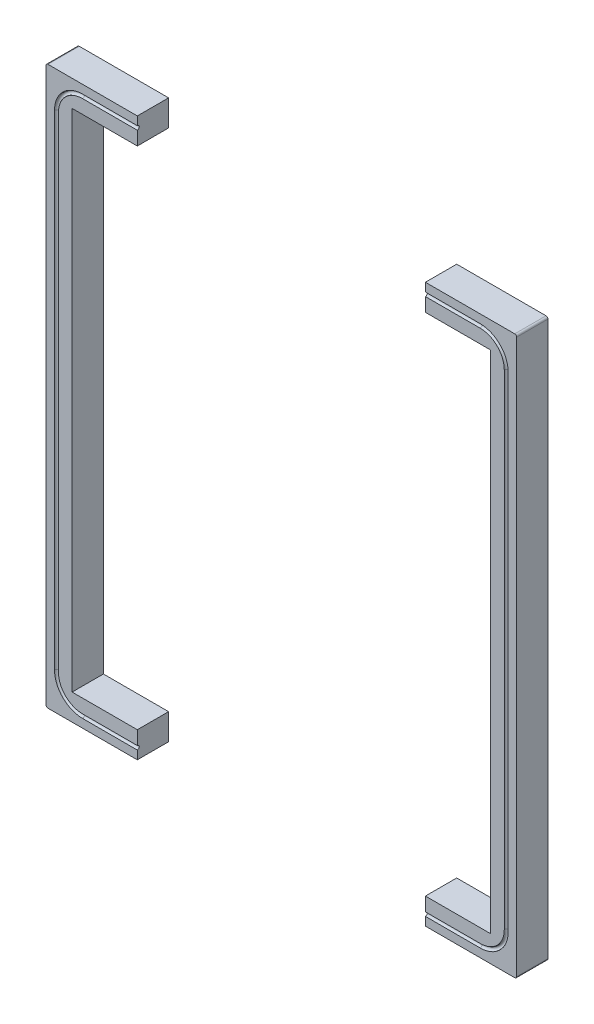
ISO-10303-21;
HEADER;
FILE_DESCRIPTION(('STEP AP214'),'2;1');
FILE_NAME('part.step','',(''),(''),'','','');
FILE_SCHEMA(('AUTOMOTIVE_DESIGN { 1 0 10303 214 1 1 1 1 }'));
ENDSEC;
DATA;
#1=APPLICATION_CONTEXT('core data for automotive mechanical design processes');
#2=APPLICATION_PROTOCOL_DEFINITION('international standard','automotive_design',2000,#1);
#3=PRODUCT_CONTEXT('',#1,'mechanical');
#4=PRODUCT('Part','Part','',(#3));
#5=PRODUCT_RELATED_PRODUCT_CATEGORY('part','',(#4));
#6=PRODUCT_DEFINITION_FORMATION('','',#4);
#7=PRODUCT_DEFINITION_CONTEXT('part definition',#1,'design');
#8=PRODUCT_DEFINITION('design','',#6,#7);
#9=PRODUCT_DEFINITION_SHAPE('','',#8);
#10=(LENGTH_UNIT() NAMED_UNIT(*) SI_UNIT(.MILLI.,.METRE.));
#11=(NAMED_UNIT(*) PLANE_ANGLE_UNIT() SI_UNIT($,.RADIAN.));
#12=(NAMED_UNIT(*) SI_UNIT($,.STERADIAN.) SOLID_ANGLE_UNIT());
#13=UNCERTAINTY_MEASURE_WITH_UNIT(LENGTH_MEASURE(1.E-05),#10,'distance_accuracy_value','');
#14=(GEOMETRIC_REPRESENTATION_CONTEXT(3) GLOBAL_UNCERTAINTY_ASSIGNED_CONTEXT((#13)) GLOBAL_UNIT_ASSIGNED_CONTEXT((#10,
#11,#12)) REPRESENTATION_CONTEXT('',''));
#15=CARTESIAN_POINT('',(0.,0.,0.));
#16=DIRECTION('',(0.,0.,1.));
#17=DIRECTION('',(1.,0.,0.));
#18=AXIS2_PLACEMENT_3D('',#15,#16,#17);
#19=CARTESIAN_POINT('',(-76.1520295904938,8.24310096287703,12.));
#20=DIRECTION('',(0.,0.,1.));
#21=DIRECTION('',(1.,0.,0.));
#22=AXIS2_PLACEMENT_3D('',#19,#20,#21);
#23=PLANE('',#22);
#24=DIRECTION('',(0.,-1.,0.));
#25=VECTOR('',#24,1.);
#26=CARTESIAN_POINT('',(69.3179704095062,222.084100962877,12.));
#27=LINE('',#26,#25);
#28=CARTESIAN_POINT('',(69.3179704095062,11.493100962877,12.));
#29=VERTEX_POINT('',#28);
#30=CARTESIAN_POINT('',(69.3179704095062,8.24310096287703,12.));
#31=VERTEX_POINT('',#30);
#32=EDGE_CURVE('E74',#29,#31,#27,.T.);
#33=ORIENTED_EDGE('',*,*,#32,.T.);
#34=DIRECTION('',(1.,0.,0.));
#35=VECTOR('',#34,1.);
#36=CARTESIAN_POINT('',(-76.1520295904938,8.24310096287703,12.));
#37=LINE('',#36,#35);
#38=CARTESIAN_POINT('',(103.581370409506,8.24310096287703,12.));
#39=VERTEX_POINT('',#38);
#40=EDGE_CURVE('E87',#31,#39,#37,.T.);
#41=ORIENTED_EDGE('',*,*,#40,.T.);
#42=CARTESIAN_POINT('',(103.581370409506,8.97970096287704,12.));
#43=DIRECTION('',(0.,0.,1.));
#44=DIRECTION('',(1.,0.,0.));
#45=AXIS2_PLACEMENT_3D('',#42,#43,#44);
#46=CIRCLE('',#45,0.7366);
#47=CARTESIAN_POINT('',(104.317970409506,8.97970096287709,12.));
#48=VERTEX_POINT('',#47);
#49=EDGE_CURVE('E96',#39,#48,#46,.T.);
#50=ORIENTED_EDGE('',*,*,#49,.T.);
#51=DIRECTION('',(0.,1.,0.));
#52=VECTOR('',#51,1.);
#53=CARTESIAN_POINT('',(104.317970409506,222.083100962877,12.));
#54=LINE('',#53,#52);
#55=CARTESIAN_POINT('',(104.317970409506,221.346500962877,12.));
#56=VERTEX_POINT('',#55);
#57=EDGE_CURVE('E98',#48,#56,#54,.T.);
#58=ORIENTED_EDGE('',*,*,#57,.T.);
#59=CARTESIAN_POINT('',(103.581370409506,221.346500962877,12.));
#60=DIRECTION('',(0.,0.,1.));
#61=DIRECTION('',(1.,0.,0.));
#62=AXIS2_PLACEMENT_3D('',#59,#60,#61);
#63=CIRCLE('',#62,0.7366);
#64=CARTESIAN_POINT('',(103.581370409506,222.083100962877,12.));
#65=VERTEX_POINT('',#64);
#66=EDGE_CURVE('E221',#56,#65,#63,.T.);
#67=ORIENTED_EDGE('',*,*,#66,.T.);
#68=DIRECTION('',(-1.,0.,0.));
#69=VECTOR('',#68,1.);
#70=CARTESIAN_POINT('',(-76.1520295904938,222.083100962877,12.));
#71=LINE('',#70,#69);
#72=CARTESIAN_POINT('',(69.3179704095062,222.083100962877,12.));
#73=VERTEX_POINT('',#72);
#74=EDGE_CURVE('E102',#65,#73,#71,.T.);
#75=ORIENTED_EDGE('',*,*,#74,.T.);
#76=DIRECTION('',(0.,1.,0.));
#77=VECTOR('',#76,1.);
#78=CARTESIAN_POINT('',(69.3179704095062,8.24210096287703,12.));
#79=LINE('',#78,#77);
#80=CARTESIAN_POINT('',(69.3179704095062,218.833100962877,12.));
#81=VERTEX_POINT('',#80);
#82=EDGE_CURVE('E152',#81,#73,#79,.T.);
#83=ORIENTED_EDGE('',*,*,#82,.F.);
#84=DIRECTION('',(-1.,0.,0.));
#85=VECTOR('',#84,1.);
#86=CARTESIAN_POINT('',(90.3179704095061,218.833100962877,12.));
#87=LINE('',#86,#85);
#88=CARTESIAN_POINT('',(90.3179704095061,218.833100962877,12.));
#89=VERTEX_POINT('',#88);
#90=EDGE_CURVE('E110',#81,#89,#87,.F.);
#91=ORIENTED_EDGE('',*,*,#90,.T.);
#92=CARTESIAN_POINT('',(90.3179704095062,208.083100962877,12.));
#93=DIRECTION('',(0.,0.,1.));
#94=DIRECTION('',(1.,0.,0.));
#95=AXIS2_PLACEMENT_3D('',#92,#93,#94);
#96=CIRCLE('',#95,10.75);
#97=CARTESIAN_POINT('',(101.067970409506,208.083100962877,12.));
#98=VERTEX_POINT('',#97);
#99=EDGE_CURVE('E208',#98,#89,#96,.T.);
#100=ORIENTED_EDGE('',*,*,#99,.F.);
#101=DIRECTION('',(0.,-1.,0.));
#102=VECTOR('',#101,1.);
#103=CARTESIAN_POINT('',(101.067970409506,208.083100962877,12.));
#104=LINE('',#103,#102);
#105=CARTESIAN_POINT('',(101.067970409506,22.2431009628771,12.));
#106=VERTEX_POINT('',#105);
#107=EDGE_CURVE('E197',#106,#98,#104,.F.);
#108=ORIENTED_EDGE('',*,*,#107,.F.);
#109=CARTESIAN_POINT('',(90.3179704095062,22.243100962877,12.));
#110=DIRECTION('',(0.,0.,1.));
#111=DIRECTION('',(1.,0.,0.));
#112=AXIS2_PLACEMENT_3D('',#109,#110,#111);
#113=CIRCLE('',#112,10.75);
#114=CARTESIAN_POINT('',(90.3179704095061,11.493100962877,12.));
#115=VERTEX_POINT('',#114);
#116=EDGE_CURVE('E184',#115,#106,#113,.T.);
#117=ORIENTED_EDGE('',*,*,#116,.F.);
#118=DIRECTION('',(-1.,0.,0.));
#119=VECTOR('',#118,1.);
#120=CARTESIAN_POINT('',(90.3179704095061,11.493100962877,12.));
#121=LINE('',#120,#119);
#122=EDGE_CURVE('E91',#29,#115,#121,.F.);
#123=ORIENTED_EDGE('',*,*,#122,.F.);
#124=EDGE_LOOP('',(#33,#41,#50,#58,#67,#75,#83,#91,#100,#108,#117,#123));
#125=FACE_BOUND('',#124,.T.);
#126=ADVANCED_FACE('F40',(#125),#23,.T.);
#127=CARTESIAN_POINT('',(-76.1520295904938,8.24310096287703,12.));
#128=DIRECTION('',(0.,1.,0.));
#129=DIRECTION('',(0.,0.,1.));
#130=AXIS2_PLACEMENT_3D('',#127,#128,#129);
#131=PLANE('',#130);
#132=ORIENTED_EDGE('',*,*,#40,.F.);
#133=DIRECTION('',(0.,0.,1.));
#134=VECTOR('',#133,1.);
#135=CARTESIAN_POINT('',(69.3179704095062,8.24310096287703,12.));
#136=LINE('',#135,#134);
#137=CARTESIAN_POINT('',(69.3179704095062,8.24310096287703,0.));
#138=VERTEX_POINT('',#137);
#139=EDGE_CURVE('E49',#138,#31,#136,.T.);
#140=ORIENTED_EDGE('',*,*,#139,.F.);
#141=DIRECTION('',(1.,0.,0.));
#142=VECTOR('',#141,1.);
#143=CARTESIAN_POINT('',(-76.1520295904938,8.24310096287703,0.));
#144=LINE('',#143,#142);
#145=CARTESIAN_POINT('',(103.581370409506,8.24310096287703,0.));
#146=VERTEX_POINT('',#145);
#147=EDGE_CURVE('E108',#138,#146,#144,.T.);
#148=ORIENTED_EDGE('',*,*,#147,.T.);
#149=DIRECTION('',(0.,0.,-1.));
#150=VECTOR('',#149,1.);
#151=CARTESIAN_POINT('',(103.581370409506,8.24310096287703,12.));
#152=LINE('',#151,#150);
#153=EDGE_CURVE('E94',#146,#39,#152,.F.);
#154=ORIENTED_EDGE('',*,*,#153,.T.);
#155=EDGE_LOOP('',(#132,#140,#148,#154));
#156=FACE_BOUND('',#155,.T.);
#157=ADVANCED_FACE('F42',(#156),#131,.F.);
#158=CARTESIAN_POINT('',(69.3179704095062,18.243100962877,12.));
#159=VERTEX_POINT('',#158);
#160=CARTESIAN_POINT('',(69.3179704095062,12.993100962877,12.));
#161=VERTEX_POINT('',#160);
#162=EDGE_CURVE('E56',#159,#161,#27,.T.);
#163=ORIENTED_EDGE('',*,*,#162,.T.);
#164=DIRECTION('',(-1.,0.,0.));
#165=VECTOR('',#164,1.);
#166=CARTESIAN_POINT('',(90.3179704095061,12.993100962877,12.));
#167=LINE('',#166,#165);
#168=CARTESIAN_POINT('',(90.3179704095061,12.993100962877,12.));
#169=VERTEX_POINT('',#168);
#170=EDGE_CURVE('E119',#169,#161,#167,.T.);
#171=ORIENTED_EDGE('',*,*,#170,.F.);
#172=CARTESIAN_POINT('',(90.3179704095062,22.243100962877,12.));
#173=DIRECTION('',(0.,0.,-1.));
#174=DIRECTION('',(-1.,0.,0.));
#175=AXIS2_PLACEMENT_3D('',#172,#173,#174);
#176=CIRCLE('',#175,9.25000000000001);
#177=CARTESIAN_POINT('',(99.5679704095062,22.2431009628771,12.));
#178=VERTEX_POINT('',#177);
#179=EDGE_CURVE('E193',#178,#169,#176,.T.);
#180=ORIENTED_EDGE('',*,*,#179,.F.);
#181=DIRECTION('',(0.,-1.,0.));
#182=VECTOR('',#181,1.);
#183=CARTESIAN_POINT('',(99.5679704095062,208.083100962877,12.));
#184=LINE('',#183,#182);
#185=CARTESIAN_POINT('',(99.5679704095062,208.083100962877,12.));
#186=VERTEX_POINT('',#185);
#187=EDGE_CURVE('E192',#186,#178,#184,.T.);
#188=ORIENTED_EDGE('',*,*,#187,.F.);
#189=CARTESIAN_POINT('',(90.3179704095062,208.083100962877,12.));
#190=DIRECTION('',(0.,0.,-1.));
#191=DIRECTION('',(-1.,0.,0.));
#192=AXIS2_PLACEMENT_3D('',#189,#190,#191);
#193=CIRCLE('',#192,9.25000000000001);
#194=CARTESIAN_POINT('',(90.3179704095061,217.333100962877,12.));
#195=VERTEX_POINT('',#194);
#196=EDGE_CURVE('E200',#195,#186,#193,.T.);
#197=ORIENTED_EDGE('',*,*,#196,.F.);
#198=DIRECTION('',(-1.,0.,0.));
#199=VECTOR('',#198,1.);
#200=CARTESIAN_POINT('',(90.3179704095061,217.333100962877,12.));
#201=LINE('',#200,#199);
#202=CARTESIAN_POINT('',(69.3179704095062,217.333100962877,12.));
#203=VERTEX_POINT('',#202);
#204=EDGE_CURVE('E132',#195,#203,#201,.T.);
#205=ORIENTED_EDGE('',*,*,#204,.T.);
#206=CARTESIAN_POINT('',(69.3179704095062,212.083100962877,12.));
#207=VERTEX_POINT('',#206);
#208=EDGE_CURVE('E159',#207,#203,#79,.T.);
#209=ORIENTED_EDGE('',*,*,#208,.F.);
#210=DIRECTION('',(-1.,0.,0.));
#211=VECTOR('',#210,1.);
#212=CARTESIAN_POINT('',(-66.1520295904938,212.083100962877,12.));
#213=LINE('',#212,#211);
#214=CARTESIAN_POINT('',(94.3179704095062,212.083100962877,12.));
#215=VERTEX_POINT('',#214);
#216=EDGE_CURVE('E116',#215,#207,#213,.T.);
#217=ORIENTED_EDGE('',*,*,#216,.F.);
#218=DIRECTION('',(0.,1.,0.));
#219=VECTOR('',#218,1.);
#220=CARTESIAN_POINT('',(94.3179704095062,212.083100962877,12.));
#221=LINE('',#220,#219);
#222=CARTESIAN_POINT('',(94.3179704095062,18.243100962877,12.));
#223=VERTEX_POINT('',#222);
#224=EDGE_CURVE('E182',#223,#215,#221,.T.);
#225=ORIENTED_EDGE('',*,*,#224,.F.);
#226=DIRECTION('',(1.,0.,0.));
#227=VECTOR('',#226,1.);
#228=CARTESIAN_POINT('',(-66.1520295904938,18.243100962877,12.));
#229=LINE('',#228,#227);
#230=EDGE_CURVE('E114',#159,#223,#229,.T.);
#231=ORIENTED_EDGE('',*,*,#230,.F.);
#232=EDGE_LOOP('',(#163,#171,#180,#188,#197,#205,#209,#217,#225,#231));
#233=FACE_BOUND('',#232,.T.);
#234=ADVANCED_FACE('F274',(#233),#23,.T.);
#235=CARTESIAN_POINT('',(-76.1520295904938,8.24310096287703,0.));
#236=DIRECTION('',(0.,0.,1.));
#237=DIRECTION('',(1.,0.,0.));
#238=AXIS2_PLACEMENT_3D('',#235,#236,#237);
#239=PLANE('',#238);
#240=ORIENTED_EDGE('',*,*,#147,.F.);
#241=DIRECTION('',(0.,-1.,0.));
#242=VECTOR('',#241,1.);
#243=CARTESIAN_POINT('',(69.3179704095062,222.084100962877,0.));
#244=LINE('',#243,#242);
#245=CARTESIAN_POINT('',(69.3179704095062,18.243100962877,0.));
#246=VERTEX_POINT('',#245);
#247=EDGE_CURVE('E76',#246,#138,#244,.T.);
#248=ORIENTED_EDGE('',*,*,#247,.F.);
#249=DIRECTION('',(-1.,0.,0.));
#250=VECTOR('',#249,1.);
#251=CARTESIAN_POINT('',(-66.1520295904938,18.243100962877,0.));
#252=LINE('',#251,#250);
#253=CARTESIAN_POINT('',(94.3179704095062,18.243100962877,0.));
#254=VERTEX_POINT('',#253);
#255=EDGE_CURVE('E111',#254,#246,#252,.T.);
#256=ORIENTED_EDGE('',*,*,#255,.F.);
#257=DIRECTION('',(0.,-1.,0.));
#258=VECTOR('',#257,1.);
#259=CARTESIAN_POINT('',(94.3179704095062,212.083100962877,0.));
#260=LINE('',#259,#258);
#261=CARTESIAN_POINT('',(94.3179704095062,212.083100962877,0.));
#262=VERTEX_POINT('',#261);
#263=EDGE_CURVE('E185',#262,#254,#260,.T.);
#264=ORIENTED_EDGE('',*,*,#263,.F.);
#265=DIRECTION('',(1.,0.,0.));
#266=VECTOR('',#265,1.);
#267=CARTESIAN_POINT('',(-66.1520295904938,212.083100962877,0.));
#268=LINE('',#267,#266);
#269=CARTESIAN_POINT('',(69.3179704095062,212.083100962877,0.));
#270=VERTEX_POINT('',#269);
#271=EDGE_CURVE('E44',#270,#262,#268,.T.);
#272=ORIENTED_EDGE('',*,*,#271,.F.);
#273=DIRECTION('',(0.,1.,0.));
#274=VECTOR('',#273,1.);
#275=CARTESIAN_POINT('',(69.3179704095062,8.24210096287703,0.));
#276=LINE('',#275,#274);
#277=CARTESIAN_POINT('',(69.3179704095062,222.083100962877,0.));
#278=VERTEX_POINT('',#277);
#279=EDGE_CURVE('E134',#270,#278,#276,.T.);
#280=ORIENTED_EDGE('',*,*,#279,.T.);
#281=DIRECTION('',(-1.,0.,0.));
#282=VECTOR('',#281,1.);
#283=CARTESIAN_POINT('',(-76.1520295904938,222.083100962877,0.));
#284=LINE('',#283,#282);
#285=CARTESIAN_POINT('',(103.581370409506,222.083100962877,0.));
#286=VERTEX_POINT('',#285);
#287=EDGE_CURVE('E104',#286,#278,#284,.T.);
#288=ORIENTED_EDGE('',*,*,#287,.F.);
#289=CARTESIAN_POINT('',(103.581370409506,221.346500962877,0.));
#290=DIRECTION('',(0.,0.,1.));
#291=DIRECTION('',(1.,0.,0.));
#292=AXIS2_PLACEMENT_3D('',#289,#290,#291);
#293=CIRCLE('',#292,0.7366);
#294=CARTESIAN_POINT('',(104.317970409506,221.346500962877,0.));
#295=VERTEX_POINT('',#294);
#296=EDGE_CURVE('E141',#286,#295,#293,.F.);
#297=ORIENTED_EDGE('',*,*,#296,.T.);
#298=DIRECTION('',(0.,1.,0.));
#299=VECTOR('',#298,1.);
#300=CARTESIAN_POINT('',(104.317970409506,222.083100962877,0.));
#301=LINE('',#300,#299);
#302=CARTESIAN_POINT('',(104.317970409506,8.97970096287709,0.));
#303=VERTEX_POINT('',#302);
#304=EDGE_CURVE('E220',#303,#295,#301,.T.);
#305=ORIENTED_EDGE('',*,*,#304,.F.);
#306=CARTESIAN_POINT('',(103.581370409506,8.97970096287704,0.));
#307=DIRECTION('',(0.,0.,1.));
#308=DIRECTION('',(1.,0.,0.));
#309=AXIS2_PLACEMENT_3D('',#306,#307,#308);
#310=CIRCLE('',#309,0.7366);
#311=EDGE_CURVE('E115',#303,#146,#310,.F.);
#312=ORIENTED_EDGE('',*,*,#311,.T.);
#313=EDGE_LOOP('',(#240,#248,#256,#264,#272,#280,#288,#297,#305,#312));
#314=FACE_BOUND('',#313,.T.);
#315=ADVANCED_FACE('F259',(#314),#239,.F.);
#316=CARTESIAN_POINT('',(-66.1520295904938,18.243100962877,-0.000999999999999265));
#317=DIRECTION('',(0.,-1.,0.));
#318=DIRECTION('',(0.,0.,-1.));
#319=AXIS2_PLACEMENT_3D('',#316,#317,#318);
#320=PLANE('',#319);
#321=ORIENTED_EDGE('',*,*,#255,.T.);
#322=DIRECTION('',(0.,0.,-1.));
#323=VECTOR('',#322,1.);
#324=CARTESIAN_POINT('',(69.3179704095062,18.243100962877,12.));
#325=LINE('',#324,#323);
#326=EDGE_CURVE('E148',#159,#246,#325,.T.);
#327=ORIENTED_EDGE('',*,*,#326,.F.);
#328=ORIENTED_EDGE('',*,*,#230,.T.);
#329=DIRECTION('',(0.,0.,1.));
#330=VECTOR('',#329,1.);
#331=CARTESIAN_POINT('',(94.3179704095062,18.243100962877,-0.000999999999999265));
#332=LINE('',#331,#330);
#333=EDGE_CURVE('E180',#254,#223,#332,.T.);
#334=ORIENTED_EDGE('',*,*,#333,.F.);
#335=EDGE_LOOP('',(#321,#327,#328,#334));
#336=FACE_BOUND('',#335,.T.);
#337=ADVANCED_FACE('F313',(#336),#320,.F.);
#338=CARTESIAN_POINT('',(90.3179704095061,12.243100962877,12.));
#339=DIRECTION('',(-1.,0.,0.));
#340=DIRECTION('',(0.,-1.,0.));
#341=AXIS2_PLACEMENT_3D('',#338,#339,#340);
#342=CYLINDRICAL_SURFACE('',#341,0.75);
#343=ORIENTED_EDGE('',*,*,#170,.T.);
#344=CARTESIAN_POINT('',(69.3179704095062,12.243100962877,12.));
#345=DIRECTION('',(1.,0.,0.));
#346=DIRECTION('',(0.,0.,-1.));
#347=AXIS2_PLACEMENT_3D('',#344,#345,#346);
#348=CIRCLE('',#347,0.75);
#349=EDGE_CURVE('E12',#29,#161,#348,.T.);
#350=ORIENTED_EDGE('',*,*,#349,.F.);
#351=ORIENTED_EDGE('',*,*,#122,.T.);
#352=CARTESIAN_POINT('',(90.3179704095061,12.243100962877,12.));
#353=DIRECTION('',(-1.,0.,0.));
#354=DIRECTION('',(0.,0.,-1.));
#355=AXIS2_PLACEMENT_3D('',#352,#353,#354);
#356=CIRCLE('',#355,0.75);
#357=EDGE_CURVE('E189',#169,#115,#356,.T.);
#358=ORIENTED_EDGE('',*,*,#357,.F.);
#359=EDGE_LOOP('',(#343,#350,#351,#358));
#360=FACE_BOUND('',#359,.T.);
#361=ADVANCED_FACE('F340',(#360),#342,.F.);
#362=CARTESIAN_POINT('',(-76.1520295904938,222.083100962877,12.));
#363=DIRECTION('',(0.,-1.,0.));
#364=DIRECTION('',(0.,0.,-1.));
#365=AXIS2_PLACEMENT_3D('',#362,#363,#364);
#366=PLANE('',#365);
#367=ORIENTED_EDGE('',*,*,#287,.T.);
#368=DIRECTION('',(0.,0.,-1.));
#369=VECTOR('',#368,1.);
#370=CARTESIAN_POINT('',(69.3179704095062,222.083100962877,0.));
#371=LINE('',#370,#369);
#372=EDGE_CURVE('E150',#73,#278,#371,.T.);
#373=ORIENTED_EDGE('',*,*,#372,.F.);
#374=ORIENTED_EDGE('',*,*,#74,.F.);
#375=DIRECTION('',(0.,0.,-1.));
#376=VECTOR('',#375,1.);
#377=CARTESIAN_POINT('',(103.581370409506,222.083100962877,12.));
#378=LINE('',#377,#376);
#379=EDGE_CURVE('E107',#65,#286,#378,.T.);
#380=ORIENTED_EDGE('',*,*,#379,.T.);
#381=EDGE_LOOP('',(#367,#373,#374,#380));
#382=FACE_BOUND('',#381,.T.);
#383=ADVANCED_FACE('F255',(#382),#366,.F.);
#384=CARTESIAN_POINT('',(-66.1520295904938,212.083100962877,-0.000999999999999265));
#385=DIRECTION('',(0.,1.,0.));
#386=DIRECTION('',(0.,0.,1.));
#387=AXIS2_PLACEMENT_3D('',#384,#385,#386);
#388=PLANE('',#387);
#389=ORIENTED_EDGE('',*,*,#216,.T.);
#390=DIRECTION('',(0.,0.,1.));
#391=VECTOR('',#390,1.);
#392=CARTESIAN_POINT('',(69.3179704095062,212.083100962877,0.));
#393=LINE('',#392,#391);
#394=EDGE_CURVE('E146',#270,#207,#393,.T.);
#395=ORIENTED_EDGE('',*,*,#394,.F.);
#396=ORIENTED_EDGE('',*,*,#271,.T.);
#397=DIRECTION('',(0.,0.,1.));
#398=VECTOR('',#397,1.);
#399=CARTESIAN_POINT('',(94.3179704095062,212.083100962877,-0.000999999999999265));
#400=LINE('',#399,#398);
#401=EDGE_CURVE('E164',#262,#215,#400,.T.);
#402=ORIENTED_EDGE('',*,*,#401,.T.);
#403=EDGE_LOOP('',(#389,#395,#396,#402));
#404=FACE_BOUND('',#403,.T.);
#405=ADVANCED_FACE('F269',(#404),#388,.F.);
#406=CARTESIAN_POINT('',(90.3179704095061,218.083100962877,12.));
#407=DIRECTION('',(-1.,0.,0.));
#408=DIRECTION('',(0.,0.,1.));
#409=AXIS2_PLACEMENT_3D('',#406,#407,#408);
#410=CYLINDRICAL_SURFACE('',#409,0.75);
#411=CARTESIAN_POINT('',(69.3179704095062,218.083100962877,12.));
#412=DIRECTION('',(1.,0.,0.));
#413=DIRECTION('',(0.,0.,-1.));
#414=AXIS2_PLACEMENT_3D('',#411,#412,#413);
#415=CIRCLE('',#414,0.75);
#416=EDGE_CURVE('E161',#81,#203,#415,.F.);
#417=ORIENTED_EDGE('',*,*,#416,.T.);
#418=ORIENTED_EDGE('',*,*,#204,.F.);
#419=CARTESIAN_POINT('',(90.3179704095061,218.083100962877,12.));
#420=DIRECTION('',(1.,0.,0.));
#421=DIRECTION('',(0.,0.,-1.));
#422=AXIS2_PLACEMENT_3D('',#419,#420,#421);
#423=CIRCLE('',#422,0.75);
#424=EDGE_CURVE('E163',#195,#89,#423,.T.);
#425=ORIENTED_EDGE('',*,*,#424,.T.);
#426=ORIENTED_EDGE('',*,*,#90,.F.);
#427=EDGE_LOOP('',(#417,#418,#425,#426));
#428=FACE_BOUND('',#427,.T.);
#429=ADVANCED_FACE('F349',(#428),#410,.F.);
#430=CARTESIAN_POINT('',(104.317970409506,222.083100962877,12.));
#431=DIRECTION('',(-1.,0.,0.));
#432=DIRECTION('',(0.,-1.,0.));
#433=AXIS2_PLACEMENT_3D('',#430,#431,#432);
#434=PLANE('',#433);
#435=ORIENTED_EDGE('',*,*,#57,.F.);
#436=DIRECTION('',(0.,0.,-1.));
#437=VECTOR('',#436,1.);
#438=CARTESIAN_POINT('',(104.317970409506,8.97970096287704,12.));
#439=LINE('',#438,#437);
#440=EDGE_CURVE('E169',#48,#303,#439,.T.);
#441=ORIENTED_EDGE('',*,*,#440,.T.);
#442=ORIENTED_EDGE('',*,*,#304,.T.);
#443=DIRECTION('',(0.,0.,-1.));
#444=VECTOR('',#443,1.);
#445=CARTESIAN_POINT('',(104.317970409506,221.346500962877,12.));
#446=LINE('',#445,#444);
#447=EDGE_CURVE('E188',#295,#56,#446,.F.);
#448=ORIENTED_EDGE('',*,*,#447,.T.);
#449=EDGE_LOOP('',(#435,#441,#442,#448));
#450=FACE_BOUND('',#449,.T.);
#451=ADVANCED_FACE('F243',(#450),#434,.F.);
#452=CARTESIAN_POINT('',(103.581370409506,221.346500962877,12.));
#453=DIRECTION('',(0.,0.,-1.));
#454=DIRECTION('',(-1.,0.,0.));
#455=AXIS2_PLACEMENT_3D('',#452,#453,#454);
#456=CYLINDRICAL_SURFACE('',#455,0.7366);
#457=ORIENTED_EDGE('',*,*,#66,.F.);
#458=ORIENTED_EDGE('',*,*,#447,.F.);
#459=ORIENTED_EDGE('',*,*,#296,.F.);
#460=ORIENTED_EDGE('',*,*,#379,.F.);
#461=EDGE_LOOP('',(#457,#458,#459,#460));
#462=FACE_BOUND('',#461,.T.);
#463=ADVANCED_FACE('F249',(#462),#456,.T.);
#464=CARTESIAN_POINT('',(103.581370409506,8.97970096287704,12.));
#465=DIRECTION('',(0.,0.,-1.));
#466=DIRECTION('',(-1.,0.,0.));
#467=AXIS2_PLACEMENT_3D('',#464,#465,#466);
#468=CYLINDRICAL_SURFACE('',#467,0.7366);
#469=ORIENTED_EDGE('',*,*,#49,.F.);
#470=ORIENTED_EDGE('',*,*,#153,.F.);
#471=ORIENTED_EDGE('',*,*,#311,.F.);
#472=ORIENTED_EDGE('',*,*,#440,.F.);
#473=EDGE_LOOP('',(#469,#470,#471,#472));
#474=FACE_BOUND('',#473,.T.);
#475=ADVANCED_FACE('F311',(#474),#468,.T.);
#476=CARTESIAN_POINT('',(94.3179704095062,212.083100962877,-0.000999999999999265));
#477=DIRECTION('',(1.,0.,0.));
#478=DIRECTION('',(0.,1.,0.));
#479=AXIS2_PLACEMENT_3D('',#476,#477,#478);
#480=PLANE('',#479);
#481=ORIENTED_EDGE('',*,*,#263,.T.);
#482=ORIENTED_EDGE('',*,*,#333,.T.);
#483=ORIENTED_EDGE('',*,*,#224,.T.);
#484=ORIENTED_EDGE('',*,*,#401,.F.);
#485=EDGE_LOOP('',(#481,#482,#483,#484));
#486=FACE_BOUND('',#485,.T.);
#487=ADVANCED_FACE('F315',(#486),#480,.F.);
#488=CARTESIAN_POINT('',(90.3179704095062,22.243100962877,12.));
#489=DIRECTION('',(0.,0.,-1.));
#490=DIRECTION('',(-1.,0.,0.));
#491=AXIS2_PLACEMENT_3D('',#488,#489,#490);
#492=TOROIDAL_SURFACE('',#491,10.,0.75);
#493=ORIENTED_EDGE('',*,*,#116,.T.);
#494=CARTESIAN_POINT('',(100.317970409506,22.2431009628771,12.));
#495=DIRECTION('',(0.,-1.,0.));
#496=DIRECTION('',(0.,0.,-1.));
#497=AXIS2_PLACEMENT_3D('',#494,#495,#496);
#498=CIRCLE('',#497,0.75);
#499=EDGE_CURVE('E194',#178,#106,#498,.T.);
#500=ORIENTED_EDGE('',*,*,#499,.F.);
#501=ORIENTED_EDGE('',*,*,#179,.T.);
#502=ORIENTED_EDGE('',*,*,#357,.T.);
#503=EDGE_LOOP('',(#493,#500,#501,#502));
#504=FACE_BOUND('',#503,.T.);
#505=ADVANCED_FACE('F317',(#504),#492,.F.);
#506=CARTESIAN_POINT('',(100.317970409506,208.083100962877,12.));
#507=DIRECTION('',(0.,-1.,0.));
#508=DIRECTION('',(1.,0.,0.));
#509=AXIS2_PLACEMENT_3D('',#506,#507,#508);
#510=CYLINDRICAL_SURFACE('',#509,0.75);
#511=ORIENTED_EDGE('',*,*,#187,.T.);
#512=ORIENTED_EDGE('',*,*,#499,.T.);
#513=ORIENTED_EDGE('',*,*,#107,.T.);
#514=CARTESIAN_POINT('',(100.317970409506,208.083100962877,12.));
#515=DIRECTION('',(0.,-1.,0.));
#516=DIRECTION('',(0.,0.,-1.));
#517=AXIS2_PLACEMENT_3D('',#514,#515,#516);
#518=CIRCLE('',#517,0.75);
#519=EDGE_CURVE('E198',#186,#98,#518,.T.);
#520=ORIENTED_EDGE('',*,*,#519,.F.);
#521=EDGE_LOOP('',(#511,#512,#513,#520));
#522=FACE_BOUND('',#521,.T.);
#523=ADVANCED_FACE('F323',(#522),#510,.F.);
#524=CARTESIAN_POINT('',(90.3179704095062,208.083100962877,12.));
#525=DIRECTION('',(0.,0.,-1.));
#526=DIRECTION('',(-1.,0.,0.));
#527=AXIS2_PLACEMENT_3D('',#524,#525,#526);
#528=TOROIDAL_SURFACE('',#527,10.,0.75);
#529=ORIENTED_EDGE('',*,*,#99,.T.);
#530=ORIENTED_EDGE('',*,*,#424,.F.);
#531=ORIENTED_EDGE('',*,*,#196,.T.);
#532=ORIENTED_EDGE('',*,*,#519,.T.);
#533=EDGE_LOOP('',(#529,#530,#531,#532));
#534=FACE_BOUND('',#533,.T.);
#535=ADVANCED_FACE('F356',(#534),#528,.F.);
#536=CARTESIAN_POINT('',(69.3179704095062,8.24210096287703,0.));
#537=DIRECTION('',(1.,0.,0.));
#538=DIRECTION('',(0.,0.,-1.));
#539=AXIS2_PLACEMENT_3D('',#536,#537,#538);
#540=PLANE('',#539);
#541=ORIENTED_EDGE('',*,*,#394,.T.);
#542=ORIENTED_EDGE('',*,*,#208,.T.);
#543=ORIENTED_EDGE('',*,*,#416,.F.);
#544=ORIENTED_EDGE('',*,*,#82,.T.);
#545=ORIENTED_EDGE('',*,*,#372,.T.);
#546=ORIENTED_EDGE('',*,*,#279,.F.);
#547=EDGE_LOOP('',(#541,#542,#543,#544,#545,#546));
#548=FACE_BOUND('',#547,.T.);
#549=ADVANCED_FACE('F266',(#548),#540,.F.);
#550=CARTESIAN_POINT('',(69.3179704095062,222.084100962877,12.));
#551=DIRECTION('',(1.,0.,0.));
#552=DIRECTION('',(0.,0.,-1.));
#553=AXIS2_PLACEMENT_3D('',#550,#551,#552);
#554=PLANE('',#553);
#555=ORIENTED_EDGE('',*,*,#326,.T.);
#556=ORIENTED_EDGE('',*,*,#247,.T.);
#557=ORIENTED_EDGE('',*,*,#139,.T.);
#558=ORIENTED_EDGE('',*,*,#32,.F.);
#559=ORIENTED_EDGE('',*,*,#349,.T.);
#560=ORIENTED_EDGE('',*,*,#162,.F.);
#561=EDGE_LOOP('',(#555,#556,#557,#558,#559,#560));
#562=FACE_BOUND('',#561,.T.);
#563=ADVANCED_FACE('F73',(#562),#554,.F.);
#564=CLOSED_SHELL('',(#126,#157,#234,#315,#337,#361,#383,#405,#429,#451,#463,#475,#487,#505,
#523,#535,#549,#563));
#565=MANIFOLD_SOLID_BREP('B2',#564);
#566=CARTESIAN_POINT('',(-72.1520295904938,22.2431009628771,12.));
#567=DIRECTION('',(0.,1.,0.));
#568=DIRECTION('',(-1.,0.,0.));
#569=AXIS2_PLACEMENT_3D('',#566,#567,#568);
#570=CYLINDRICAL_SURFACE('',#569,0.75);
#571=DIRECTION('',(0.,1.,0.));
#572=VECTOR('',#571,1.);
#573=CARTESIAN_POINT('',(-71.4020295904938,22.2431009628771,12.));
#574=LINE('',#573,#572);
#575=CARTESIAN_POINT('',(-71.4020295904938,22.2431009628771,12.));
#576=VERTEX_POINT('',#575);
#577=CARTESIAN_POINT('',(-71.4020295904938,208.083100962877,12.));
#578=VERTEX_POINT('',#577);
#579=EDGE_CURVE('E650',#576,#578,#574,.T.);
#580=ORIENTED_EDGE('',*,*,#579,.T.);
#581=CARTESIAN_POINT('',(-72.1520295904938,208.083100962877,12.));
#582=DIRECTION('',(0.,1.,0.));
#583=DIRECTION('',(0.,0.,-1.));
#584=AXIS2_PLACEMENT_3D('',#581,#582,#583);
#585=CIRCLE('',#584,0.75);
#586=CARTESIAN_POINT('',(-72.9020295904938,208.083100962877,12.));
#587=VERTEX_POINT('',#586);
#588=EDGE_CURVE('E669',#578,#587,#585,.T.);
#589=ORIENTED_EDGE('',*,*,#588,.T.);
#590=DIRECTION('',(0.,1.,0.));
#591=VECTOR('',#590,1.);
#592=CARTESIAN_POINT('',(-72.9020295904938,22.2431009628771,12.));
#593=LINE('',#592,#591);
#594=CARTESIAN_POINT('',(-72.9020295904938,22.2431009628771,12.));
#595=VERTEX_POINT('',#594);
#596=EDGE_CURVE('E484',#587,#595,#593,.F.);
#597=ORIENTED_EDGE('',*,*,#596,.T.);
#598=CARTESIAN_POINT('',(-72.1520295904938,22.2431009628771,12.));
#599=DIRECTION('',(0.,1.,0.));
#600=DIRECTION('',(0.,0.,-1.));
#601=AXIS2_PLACEMENT_3D('',#598,#599,#600);
#602=CIRCLE('',#601,0.75);
#603=EDGE_CURVE('E666',#576,#595,#602,.T.);
#604=ORIENTED_EDGE('',*,*,#603,.F.);
#605=EDGE_LOOP('',(#580,#589,#597,#604));
#606=FACE_BOUND('',#605,.T.);
#607=ADVANCED_FACE('F476',(#606),#570,.F.);
#608=CARTESIAN_POINT('',(-62.1520295904938,208.083100962877,12.));
#609=DIRECTION('',(0.,0.,-1.));
#610=DIRECTION('',(-1.,0.,0.));
#611=AXIS2_PLACEMENT_3D('',#608,#609,#610);
#612=TOROIDAL_SURFACE('',#611,10.,0.75);
#613=CARTESIAN_POINT('',(-62.1520295904938,208.083100962877,12.));
#614=DIRECTION('',(0.,0.,1.));
#615=DIRECTION('',(1.,0.,0.));
#616=AXIS2_PLACEMENT_3D('',#613,#614,#615);
#617=CIRCLE('',#616,10.75);
#618=CARTESIAN_POINT('',(-62.1520295904937,218.833100962877,12.));
#619=VERTEX_POINT('',#618);
#620=EDGE_CURVE('E38',#619,#587,#617,.T.);
#621=ORIENTED_EDGE('',*,*,#620,.T.);
#622=ORIENTED_EDGE('',*,*,#588,.F.);
#623=CARTESIAN_POINT('',(-62.1520295904938,208.083100962877,12.));
#624=DIRECTION('',(0.,0.,-1.));
#625=DIRECTION('',(-1.,0.,0.));
#626=AXIS2_PLACEMENT_3D('',#623,#624,#625);
#627=CIRCLE('',#626,9.25000000000002);
#628=CARTESIAN_POINT('',(-62.1520295904937,217.333100962877,12.));
#629=VERTEX_POINT('',#628);
#630=EDGE_CURVE('E652',#578,#629,#627,.T.);
#631=ORIENTED_EDGE('',*,*,#630,.T.);
#632=CARTESIAN_POINT('',(-62.1520295904937,218.083100962877,12.));
#633=DIRECTION('',(1.,0.,0.));
#634=DIRECTION('',(0.,0.,-1.));
#635=AXIS2_PLACEMENT_3D('',#632,#633,#634);
#636=CIRCLE('',#635,0.75);
#637=EDGE_CURVE('E689',#629,#619,#636,.T.);
#638=ORIENTED_EDGE('',*,*,#637,.T.);
#639=EDGE_LOOP('',(#621,#622,#631,#638));
#640=FACE_BOUND('',#639,.T.);
#641=ADVANCED_FACE('F766',(#640),#612,.F.);
#642=CARTESIAN_POINT('',(90.3179704095061,218.083100962877,12.));
#643=DIRECTION('',(-1.,0.,0.));
#644=DIRECTION('',(0.,0.,1.));
#645=AXIS2_PLACEMENT_3D('',#642,#643,#644);
#646=CYLINDRICAL_SURFACE('',#645,0.75);
#647=CARTESIAN_POINT('',(-41.1520295904938,218.083100962877,12.));
#648=DIRECTION('',(-1.,0.,0.));
#649=DIRECTION('',(0.,0.,1.));
#650=AXIS2_PLACEMENT_3D('',#647,#648,#649);
#651=CIRCLE('',#650,0.75);
#652=CARTESIAN_POINT('',(-41.1520295904938,217.333100962877,12.));
#653=VERTEX_POINT('',#652);
#654=CARTESIAN_POINT('',(-41.1520295904938,218.833100962877,12.));
#655=VERTEX_POINT('',#654);
#656=EDGE_CURVE('E682',#653,#655,#651,.F.);
#657=ORIENTED_EDGE('',*,*,#656,.T.);
#658=DIRECTION('',(-1.,0.,0.));
#659=VECTOR('',#658,1.);
#660=CARTESIAN_POINT('',(90.3179704095061,218.833100962877,12.));
#661=LINE('',#660,#659);
#662=EDGE_CURVE('E655',#619,#655,#661,.F.);
#663=ORIENTED_EDGE('',*,*,#662,.F.);
#664=ORIENTED_EDGE('',*,*,#637,.F.);
#665=DIRECTION('',(-1.,0.,0.));
#666=VECTOR('',#665,1.);
#667=CARTESIAN_POINT('',(90.3179704095061,217.333100962877,12.));
#668=LINE('',#667,#666);
#669=EDGE_CURVE('E644',#653,#629,#668,.T.);
#670=ORIENTED_EDGE('',*,*,#669,.F.);
#671=EDGE_LOOP('',(#657,#663,#664,#670));
#672=FACE_BOUND('',#671,.T.);
#673=ADVANCED_FACE('F771',(#672),#646,.F.);
#674=CARTESIAN_POINT('',(-66.1520295904938,212.083100962877,-0.000999999999999265));
#675=DIRECTION('',(0.,1.,0.));
#676=DIRECTION('',(0.,0.,1.));
#677=AXIS2_PLACEMENT_3D('',#674,#675,#676);
#678=PLANE('',#677);
#679=DIRECTION('',(1.,0.,0.));
#680=VECTOR('',#679,1.);
#681=CARTESIAN_POINT('',(-66.1520295904938,212.083100962877,0.));
#682=LINE('',#681,#680);
#683=CARTESIAN_POINT('',(-66.1520295904938,212.083100962877,0.));
#684=VERTEX_POINT('',#683);
#685=CARTESIAN_POINT('',(-41.1520295904938,212.083100962877,0.));
#686=VERTEX_POINT('',#685);
#687=EDGE_CURVE('E692',#684,#686,#682,.T.);
#688=ORIENTED_EDGE('',*,*,#687,.T.);
#689=DIRECTION('',(0.,0.,-1.));
#690=VECTOR('',#689,1.);
#691=CARTESIAN_POINT('',(-41.1520295904938,212.083100962877,0.));
#692=LINE('',#691,#690);
#693=CARTESIAN_POINT('',(-41.1520295904938,212.083100962877,12.));
#694=VERTEX_POINT('',#693);
#695=EDGE_CURVE('E729',#694,#686,#692,.T.);
#696=ORIENTED_EDGE('',*,*,#695,.F.);
#697=DIRECTION('',(-1.,0.,0.));
#698=VECTOR('',#697,1.);
#699=CARTESIAN_POINT('',(-66.1520295904938,212.083100962877,12.));
#700=LINE('',#699,#698);
#701=CARTESIAN_POINT('',(-66.1520295904938,212.083100962877,12.));
#702=VERTEX_POINT('',#701);
#703=EDGE_CURVE('E703',#694,#702,#700,.T.);
#704=ORIENTED_EDGE('',*,*,#703,.T.);
#705=DIRECTION('',(0.,0.,1.));
#706=VECTOR('',#705,1.);
#707=CARTESIAN_POINT('',(-66.1520295904938,212.083100962877,-0.000999999999999265));
#708=LINE('',#707,#706);
#709=EDGE_CURVE('E706',#684,#702,#708,.T.);
#710=ORIENTED_EDGE('',*,*,#709,.F.);
#711=EDGE_LOOP('',(#688,#696,#704,#710));
#712=FACE_BOUND('',#711,.T.);
#713=ADVANCED_FACE('F728',(#712),#678,.F.);
#714=CARTESIAN_POINT('',(-41.1520295904938,8.24210096287703,0.));
#715=DIRECTION('',(-1.,0.,0.));
#716=DIRECTION('',(0.,0.,1.));
#717=AXIS2_PLACEMENT_3D('',#714,#715,#716);
#718=PLANE('',#717);
#719=ORIENTED_EDGE('',*,*,#695,.T.);
#720=DIRECTION('',(0.,1.,0.));
#721=VECTOR('',#720,1.);
#722=CARTESIAN_POINT('',(-41.1520295904938,8.24210096287703,0.));
#723=LINE('',#722,#721);
#724=CARTESIAN_POINT('',(-41.1520295904938,222.083100962877,0.));
#725=VERTEX_POINT('',#724);
#726=EDGE_CURVE('E725',#686,#725,#723,.T.);
#727=ORIENTED_EDGE('',*,*,#726,.T.);
#728=DIRECTION('',(0.,0.,1.));
#729=VECTOR('',#728,1.);
#730=CARTESIAN_POINT('',(-41.1520295904938,222.083100962877,0.));
#731=LINE('',#730,#729);
#732=CARTESIAN_POINT('',(-41.1520295904938,222.083100962877,12.));
#733=VERTEX_POINT('',#732);
#734=EDGE_CURVE('E738',#725,#733,#731,.T.);
#735=ORIENTED_EDGE('',*,*,#734,.T.);
#736=DIRECTION('',(0.,1.,0.));
#737=VECTOR('',#736,1.);
#738=CARTESIAN_POINT('',(-41.1520295904938,8.24210096287703,12.));
#739=LINE('',#738,#737);
#740=EDGE_CURVE('E499',#655,#733,#739,.T.);
#741=ORIENTED_EDGE('',*,*,#740,.F.);
#742=ORIENTED_EDGE('',*,*,#656,.F.);
#743=EDGE_CURVE('E684',#694,#653,#739,.T.);
#744=ORIENTED_EDGE('',*,*,#743,.F.);
#745=EDGE_LOOP('',(#719,#727,#735,#741,#742,#744));
#746=FACE_BOUND('',#745,.T.);
#747=ADVANCED_FACE('F741',(#746),#718,.F.);
#748=CARTESIAN_POINT('',(-76.1520295904938,222.083100962877,12.));
#749=DIRECTION('',(0.,-1.,0.));
#750=DIRECTION('',(0.,0.,-1.));
#751=AXIS2_PLACEMENT_3D('',#748,#749,#750);
#752=PLANE('',#751);
#753=DIRECTION('',(-1.,0.,0.));
#754=VECTOR('',#753,1.);
#755=CARTESIAN_POINT('',(-76.1520295904938,222.083100962877,12.));
#756=LINE('',#755,#754);
#757=CARTESIAN_POINT('',(-75.4154295904938,222.083100962877,12.));
#758=VERTEX_POINT('',#757);
#759=EDGE_CURVE('E611',#733,#758,#756,.T.);
#760=ORIENTED_EDGE('',*,*,#759,.F.);
#761=ORIENTED_EDGE('',*,*,#734,.F.);
#762=DIRECTION('',(-1.,0.,0.));
#763=VECTOR('',#762,1.);
#764=CARTESIAN_POINT('',(-76.1520295904938,222.083100962877,0.));
#765=LINE('',#764,#763);
#766=CARTESIAN_POINT('',(-75.4154295904938,222.083100962877,0.));
#767=VERTEX_POINT('',#766);
#768=EDGE_CURVE('E616',#725,#767,#765,.T.);
#769=ORIENTED_EDGE('',*,*,#768,.T.);
#770=DIRECTION('',(0.,0.,-1.));
#771=VECTOR('',#770,1.);
#772=CARTESIAN_POINT('',(-75.4154295904938,222.083100962877,12.));
#773=LINE('',#772,#771);
#774=EDGE_CURVE('E639',#767,#758,#773,.F.);
#775=ORIENTED_EDGE('',*,*,#774,.T.);
#776=EDGE_LOOP('',(#760,#761,#769,#775));
#777=FACE_BOUND('',#776,.T.);
#778=ADVANCED_FACE('F744',(#777),#752,.F.);
#779=CARTESIAN_POINT('',(-75.4154295904938,221.346500962877,12.));
#780=DIRECTION('',(0.,0.,-1.));
#781=DIRECTION('',(-1.,0.,0.));
#782=AXIS2_PLACEMENT_3D('',#779,#780,#781);
#783=CYLINDRICAL_SURFACE('',#782,0.7366);
#784=CARTESIAN_POINT('',(-75.4154295904938,221.346500962877,12.));
#785=DIRECTION('',(0.,0.,1.));
#786=DIRECTION('',(1.,0.,0.));
#787=AXIS2_PLACEMENT_3D('',#784,#785,#786);
#788=CIRCLE('',#787,0.7366);
#789=CARTESIAN_POINT('',(-76.1520295904938,221.346500962877,12.));
#790=VERTEX_POINT('',#789);
#791=EDGE_CURVE('E642',#758,#790,#788,.T.);
#792=ORIENTED_EDGE('',*,*,#791,.F.);
#793=ORIENTED_EDGE('',*,*,#774,.F.);
#794=CARTESIAN_POINT('',(-75.4154295904938,221.346500962877,0.));
#795=DIRECTION('',(0.,0.,1.));
#796=DIRECTION('',(1.,0.,0.));
#797=AXIS2_PLACEMENT_3D('',#794,#795,#796);
#798=CIRCLE('',#797,0.7366);
#799=CARTESIAN_POINT('',(-76.1520295904938,221.346500962877,0.));
#800=VERTEX_POINT('',#799);
#801=EDGE_CURVE('E636',#800,#767,#798,.F.);
#802=ORIENTED_EDGE('',*,*,#801,.F.);
#803=DIRECTION('',(0.,0.,-1.));
#804=VECTOR('',#803,1.);
#805=CARTESIAN_POINT('',(-76.1520295904938,221.346500962877,12.));
#806=LINE('',#805,#804);
#807=EDGE_CURVE('E633',#790,#800,#806,.T.);
#808=ORIENTED_EDGE('',*,*,#807,.F.);
#809=EDGE_LOOP('',(#792,#793,#802,#808));
#810=FACE_BOUND('',#809,.T.);
#811=ADVANCED_FACE('F478',(#810),#783,.T.);
#812=CARTESIAN_POINT('',(-76.1520295904938,222.083100962877,12.));
#813=DIRECTION('',(1.,0.,0.));
#814=DIRECTION('',(0.,1.,0.));
#815=AXIS2_PLACEMENT_3D('',#812,#813,#814);
#816=PLANE('',#815);
#817=DIRECTION('',(0.,-1.,0.));
#818=VECTOR('',#817,1.);
#819=CARTESIAN_POINT('',(-76.1520295904938,222.083100962877,12.));
#820=LINE('',#819,#818);
#821=CARTESIAN_POINT('',(-76.1520295904938,8.97970096287709,12.));
#822=VERTEX_POINT('',#821);
#823=EDGE_CURVE('E612',#790,#822,#820,.T.);
#824=ORIENTED_EDGE('',*,*,#823,.F.);
#825=ORIENTED_EDGE('',*,*,#807,.T.);
#826=DIRECTION('',(0.,-1.,0.));
#827=VECTOR('',#826,1.);
#828=CARTESIAN_POINT('',(-76.1520295904938,222.083100962877,0.));
#829=LINE('',#828,#827);
#830=CARTESIAN_POINT('',(-76.1520295904938,8.97970096287709,0.));
#831=VERTEX_POINT('',#830);
#832=EDGE_CURVE('E620',#800,#831,#829,.T.);
#833=ORIENTED_EDGE('',*,*,#832,.T.);
#834=DIRECTION('',(0.,0.,-1.));
#835=VECTOR('',#834,1.);
#836=CARTESIAN_POINT('',(-76.1520295904938,8.97970096287704,12.));
#837=LINE('',#836,#835);
#838=EDGE_CURVE('E629',#831,#822,#837,.F.);
#839=ORIENTED_EDGE('',*,*,#838,.T.);
#840=EDGE_LOOP('',(#824,#825,#833,#839));
#841=FACE_BOUND('',#840,.T.);
#842=ADVANCED_FACE('F752',(#841),#816,.F.);
#843=CARTESIAN_POINT('',(-75.4154295904938,8.97970096287703,12.));
#844=DIRECTION('',(0.,0.,-1.));
#845=DIRECTION('',(-1.,0.,0.));
#846=AXIS2_PLACEMENT_3D('',#843,#844,#845);
#847=CYLINDRICAL_SURFACE('',#846,0.7366);
#848=CARTESIAN_POINT('',(-75.4154295904938,8.97970096287703,12.));
#849=DIRECTION('',(0.,0.,1.));
#850=DIRECTION('',(1.,0.,0.));
#851=AXIS2_PLACEMENT_3D('',#848,#849,#850);
#852=CIRCLE('',#851,0.7366);
#853=CARTESIAN_POINT('',(-75.4154295904938,8.24310096287703,12.));
#854=VERTEX_POINT('',#853);
#855=EDGE_CURVE('E610',#822,#854,#852,.T.);
#856=ORIENTED_EDGE('',*,*,#855,.F.);
#857=ORIENTED_EDGE('',*,*,#838,.F.);
#858=CARTESIAN_POINT('',(-75.4154295904938,8.97970096287703,0.));
#859=DIRECTION('',(0.,0.,1.));
#860=DIRECTION('',(1.,0.,0.));
#861=AXIS2_PLACEMENT_3D('',#858,#859,#860);
#862=CIRCLE('',#861,0.7366);
#863=CARTESIAN_POINT('',(-75.4154295904938,8.24310096287703,0.));
#864=VERTEX_POINT('',#863);
#865=EDGE_CURVE('E626',#864,#831,#862,.F.);
#866=ORIENTED_EDGE('',*,*,#865,.F.);
#867=DIRECTION('',(0.,0.,-1.));
#868=VECTOR('',#867,1.);
#869=CARTESIAN_POINT('',(-75.4154295904938,8.24310096287703,12.));
#870=LINE('',#869,#868);
#871=EDGE_CURVE('E614',#854,#864,#870,.T.);
#872=ORIENTED_EDGE('',*,*,#871,.F.);
#873=EDGE_LOOP('',(#856,#857,#866,#872));
#874=FACE_BOUND('',#873,.T.);
#875=ADVANCED_FACE('F755',(#874),#847,.T.);
#876=CARTESIAN_POINT('',(-66.1520295904938,212.083100962877,-0.000999999999999265));
#877=DIRECTION('',(-1.,0.,0.));
#878=DIRECTION('',(0.,-1.,0.));
#879=AXIS2_PLACEMENT_3D('',#876,#877,#878);
#880=PLANE('',#879);
#881=DIRECTION('',(0.,1.,0.));
#882=VECTOR('',#881,1.);
#883=CARTESIAN_POINT('',(-66.1520295904938,212.083100962877,0.));
#884=LINE('',#883,#882);
#885=CARTESIAN_POINT('',(-66.1520295904938,18.243100962877,0.));
#886=VERTEX_POINT('',#885);
#887=EDGE_CURVE('E695',#886,#684,#884,.T.);
#888=ORIENTED_EDGE('',*,*,#887,.T.);
#889=ORIENTED_EDGE('',*,*,#709,.T.);
#890=DIRECTION('',(0.,-1.,0.));
#891=VECTOR('',#890,1.);
#892=CARTESIAN_POINT('',(-66.1520295904938,212.083100962877,12.));
#893=LINE('',#892,#891);
#894=CARTESIAN_POINT('',(-66.1520295904938,18.243100962877,12.));
#895=VERTEX_POINT('',#894);
#896=EDGE_CURVE('E698',#702,#895,#893,.T.);
#897=ORIENTED_EDGE('',*,*,#896,.T.);
#898=DIRECTION('',(0.,0.,1.));
#899=VECTOR('',#898,1.);
#900=CARTESIAN_POINT('',(-66.1520295904938,18.243100962877,-0.000999999999999265));
#901=LINE('',#900,#899);
#902=EDGE_CURVE('E705',#886,#895,#901,.T.);
#903=ORIENTED_EDGE('',*,*,#902,.F.);
#904=EDGE_LOOP('',(#888,#889,#897,#903));
#905=FACE_BOUND('',#904,.T.);
#906=ADVANCED_FACE('F719',(#905),#880,.F.);
#907=CARTESIAN_POINT('',(-62.1520295904938,22.243100962877,12.));
#908=DIRECTION('',(0.,0.,-1.));
#909=DIRECTION('',(-1.,0.,0.));
#910=AXIS2_PLACEMENT_3D('',#907,#908,#909);
#911=TOROIDAL_SURFACE('',#910,10.,0.75);
#912=CARTESIAN_POINT('',(-62.1520295904938,22.243100962877,12.));
#913=DIRECTION('',(0.,0.,1.));
#914=DIRECTION('',(1.,0.,0.));
#915=AXIS2_PLACEMENT_3D('',#912,#913,#914);
#916=CIRCLE('',#915,10.75);
#917=CARTESIAN_POINT('',(-62.1520295904937,11.493100962877,12.));
#918=VERTEX_POINT('',#917);
#919=EDGE_CURVE('E660',#595,#918,#916,.T.);
#920=ORIENTED_EDGE('',*,*,#919,.T.);
#921=CARTESIAN_POINT('',(-62.1520295904937,12.243100962877,12.));
#922=DIRECTION('',(-1.,0.,0.));
#923=DIRECTION('',(0.,0.,-1.));
#924=AXIS2_PLACEMENT_3D('',#921,#922,#923);
#925=CIRCLE('',#924,0.75);
#926=CARTESIAN_POINT('',(-62.1520295904937,12.993100962877,12.));
#927=VERTEX_POINT('',#926);
#928=EDGE_CURVE('E677',#927,#918,#925,.T.);
#929=ORIENTED_EDGE('',*,*,#928,.F.);
#930=CARTESIAN_POINT('',(-62.1520295904938,22.243100962877,12.));
#931=DIRECTION('',(0.,0.,-1.));
#932=DIRECTION('',(-1.,0.,0.));
#933=AXIS2_PLACEMENT_3D('',#930,#931,#932);
#934=CIRCLE('',#933,9.25000000000001);
#935=EDGE_CURVE('E648',#927,#576,#934,.T.);
#936=ORIENTED_EDGE('',*,*,#935,.T.);
#937=ORIENTED_EDGE('',*,*,#603,.T.);
#938=EDGE_LOOP('',(#920,#929,#936,#937));
#939=FACE_BOUND('',#938,.T.);
#940=ADVANCED_FACE('F673',(#939),#911,.F.);
#941=CARTESIAN_POINT('',(90.3179704095061,12.243100962877,12.));
#942=DIRECTION('',(-1.,0.,0.));
#943=DIRECTION('',(0.,-1.,0.));
#944=AXIS2_PLACEMENT_3D('',#941,#942,#943);
#945=CYLINDRICAL_SURFACE('',#944,0.75);
#946=DIRECTION('',(-1.,0.,0.));
#947=VECTOR('',#946,1.);
#948=CARTESIAN_POINT('',(90.3179704095061,11.493100962877,12.));
#949=LINE('',#948,#947);
#950=CARTESIAN_POINT('',(-41.1520295904938,11.493100962877,12.));
#951=VERTEX_POINT('',#950);
#952=EDGE_CURVE('E658',#918,#951,#949,.F.);
#953=ORIENTED_EDGE('',*,*,#952,.T.);
#954=CARTESIAN_POINT('',(-41.1520295904938,12.243100962877,12.));
#955=DIRECTION('',(-1.,0.,0.));
#956=DIRECTION('',(0.,0.,1.));
#957=AXIS2_PLACEMENT_3D('',#954,#955,#956);
#958=CIRCLE('',#957,0.75);
#959=CARTESIAN_POINT('',(-41.1520295904938,12.993100962877,12.));
#960=VERTEX_POINT('',#959);
#961=EDGE_CURVE('E591',#960,#951,#958,.T.);
#962=ORIENTED_EDGE('',*,*,#961,.F.);
#963=DIRECTION('',(-1.,0.,0.));
#964=VECTOR('',#963,1.);
#965=CARTESIAN_POINT('',(90.3179704095061,12.993100962877,12.));
#966=LINE('',#965,#964);
#967=EDGE_CURVE('E646',#960,#927,#966,.T.);
#968=ORIENTED_EDGE('',*,*,#967,.T.);
#969=ORIENTED_EDGE('',*,*,#928,.T.);
#970=EDGE_LOOP('',(#953,#962,#968,#969));
#971=FACE_BOUND('',#970,.T.);
#972=ADVANCED_FACE('F680',(#971),#945,.F.);
#973=CARTESIAN_POINT('',(-66.1520295904938,18.243100962877,-0.000999999999999265));
#974=DIRECTION('',(0.,-1.,0.));
#975=DIRECTION('',(0.,0.,-1.));
#976=AXIS2_PLACEMENT_3D('',#973,#974,#975);
#977=PLANE('',#976);
#978=DIRECTION('',(1.,0.,0.));
#979=VECTOR('',#978,1.);
#980=CARTESIAN_POINT('',(-66.1520295904938,18.243100962877,12.));
#981=LINE('',#980,#979);
#982=CARTESIAN_POINT('',(-41.1520295904938,18.243100962877,12.));
#983=VERTEX_POINT('',#982);
#984=EDGE_CURVE('E700',#895,#983,#981,.T.);
#985=ORIENTED_EDGE('',*,*,#984,.T.);
#986=DIRECTION('',(0.,0.,1.));
#987=VECTOR('',#986,1.);
#988=CARTESIAN_POINT('',(-41.1520295904938,18.243100962877,12.));
#989=LINE('',#988,#987);
#990=CARTESIAN_POINT('',(-41.1520295904938,18.243100962877,0.));
#991=VERTEX_POINT('',#990);
#992=EDGE_CURVE('E606',#991,#983,#989,.T.);
#993=ORIENTED_EDGE('',*,*,#992,.F.);
#994=DIRECTION('',(-1.,0.,0.));
#995=VECTOR('',#994,1.);
#996=CARTESIAN_POINT('',(-66.1520295904938,18.243100962877,0.));
#997=LINE('',#996,#995);
#998=EDGE_CURVE('E622',#991,#886,#997,.T.);
#999=ORIENTED_EDGE('',*,*,#998,.T.);
#1000=ORIENTED_EDGE('',*,*,#902,.T.);
#1001=EDGE_LOOP('',(#985,#993,#999,#1000));
#1002=FACE_BOUND('',#1001,.T.);
#1003=ADVANCED_FACE('F714',(#1002),#977,.F.);
#1004=CARTESIAN_POINT('',(-76.1520295904938,8.24310096287703,0.));
#1005=DIRECTION('',(0.,0.,1.));
#1006=DIRECTION('',(1.,0.,0.));
#1007=AXIS2_PLACEMENT_3D('',#1004,#1005,#1006);
#1008=PLANE('',#1007);
#1009=ORIENTED_EDGE('',*,*,#998,.F.);
#1010=DIRECTION('',(0.,-1.,0.));
#1011=VECTOR('',#1010,1.);
#1012=CARTESIAN_POINT('',(-41.1520295904938,222.084100962877,0.));
#1013=LINE('',#1012,#1011);
#1014=CARTESIAN_POINT('',(-41.1520295904938,8.24310096287703,0.));
#1015=VERTEX_POINT('',#1014);
#1016=EDGE_CURVE('E734',#991,#1015,#1013,.T.);
#1017=ORIENTED_EDGE('',*,*,#1016,.T.);
#1018=DIRECTION('',(1.,0.,0.));
#1019=VECTOR('',#1018,1.);
#1020=CARTESIAN_POINT('',(-76.1520295904938,8.24310096287703,0.));
#1021=LINE('',#1020,#1019);
#1022=EDGE_CURVE('E605',#864,#1015,#1021,.T.);
#1023=ORIENTED_EDGE('',*,*,#1022,.F.);
#1024=ORIENTED_EDGE('',*,*,#865,.T.);
#1025=ORIENTED_EDGE('',*,*,#832,.F.);
#1026=ORIENTED_EDGE('',*,*,#801,.T.);
#1027=ORIENTED_EDGE('',*,*,#768,.F.);
#1028=ORIENTED_EDGE('',*,*,#726,.F.);
#1029=ORIENTED_EDGE('',*,*,#687,.F.);
#1030=ORIENTED_EDGE('',*,*,#887,.F.);
#1031=EDGE_LOOP('',(#1009,#1017,#1023,#1024,#1025,#1026,#1027,#1028,#1029,#1030));
#1032=FACE_BOUND('',#1031,.T.);
#1033=ADVANCED_FACE('F722',(#1032),#1008,.F.);
#1034=CARTESIAN_POINT('',(-76.1520295904938,8.24310096287703,12.));
#1035=DIRECTION('',(0.,0.,1.));
#1036=DIRECTION('',(1.,0.,0.));
#1037=AXIS2_PLACEMENT_3D('',#1034,#1035,#1036);
#1038=PLANE('',#1037);
#1039=DIRECTION('',(0.,-1.,0.));
#1040=VECTOR('',#1039,1.);
#1041=CARTESIAN_POINT('',(-41.1520295904938,222.084100962877,12.));
#1042=LINE('',#1041,#1040);
#1043=EDGE_CURVE('E491',#983,#960,#1042,.T.);
#1044=ORIENTED_EDGE('',*,*,#1043,.F.);
#1045=ORIENTED_EDGE('',*,*,#984,.F.);
#1046=ORIENTED_EDGE('',*,*,#896,.F.);
#1047=ORIENTED_EDGE('',*,*,#703,.F.);
#1048=ORIENTED_EDGE('',*,*,#743,.T.);
#1049=ORIENTED_EDGE('',*,*,#669,.T.);
#1050=ORIENTED_EDGE('',*,*,#630,.F.);
#1051=ORIENTED_EDGE('',*,*,#579,.F.);
#1052=ORIENTED_EDGE('',*,*,#935,.F.);
#1053=ORIENTED_EDGE('',*,*,#967,.F.);
#1054=EDGE_LOOP('',(#1044,#1045,#1046,#1047,#1048,#1049,#1050,#1051,#1052,#1053));
#1055=FACE_BOUND('',#1054,.T.);
#1056=ADVANCED_FACE('F732',(#1055),#1038,.T.);
#1057=CARTESIAN_POINT('',(-76.1520295904938,8.24310096287703,12.));
#1058=DIRECTION('',(0.,1.,0.));
#1059=DIRECTION('',(0.,0.,1.));
#1060=AXIS2_PLACEMENT_3D('',#1057,#1058,#1059);
#1061=PLANE('',#1060);
#1062=ORIENTED_EDGE('',*,*,#1022,.T.);
#1063=DIRECTION('',(0.,0.,-1.));
#1064=VECTOR('',#1063,1.);
#1065=CARTESIAN_POINT('',(-41.1520295904938,8.24310096287703,12.));
#1066=LINE('',#1065,#1064);
#1067=CARTESIAN_POINT('',(-41.1520295904938,8.24310096287703,12.));
#1068=VERTEX_POINT('',#1067);
#1069=EDGE_CURVE('E589',#1068,#1015,#1066,.T.);
#1070=ORIENTED_EDGE('',*,*,#1069,.F.);
#1071=DIRECTION('',(1.,0.,0.));
#1072=VECTOR('',#1071,1.);
#1073=CARTESIAN_POINT('',(-76.1520295904938,8.24310096287703,12.));
#1074=LINE('',#1073,#1072);
#1075=EDGE_CURVE('E602',#854,#1068,#1074,.T.);
#1076=ORIENTED_EDGE('',*,*,#1075,.F.);
#1077=ORIENTED_EDGE('',*,*,#871,.T.);
#1078=EDGE_LOOP('',(#1062,#1070,#1076,#1077));
#1079=FACE_BOUND('',#1078,.T.);
#1080=ADVANCED_FACE('F600',(#1079),#1061,.F.);
#1081=EDGE_CURVE('E586',#951,#1068,#1042,.T.);
#1082=ORIENTED_EDGE('',*,*,#1081,.F.);
#1083=ORIENTED_EDGE('',*,*,#952,.F.);
#1084=ORIENTED_EDGE('',*,*,#919,.F.);
#1085=ORIENTED_EDGE('',*,*,#596,.F.);
#1086=ORIENTED_EDGE('',*,*,#620,.F.);
#1087=ORIENTED_EDGE('',*,*,#662,.T.);
#1088=ORIENTED_EDGE('',*,*,#740,.T.);
#1089=ORIENTED_EDGE('',*,*,#759,.T.);
#1090=ORIENTED_EDGE('',*,*,#791,.T.);
#1091=ORIENTED_EDGE('',*,*,#823,.T.);
#1092=ORIENTED_EDGE('',*,*,#855,.T.);
#1093=ORIENTED_EDGE('',*,*,#1075,.T.);
#1094=EDGE_LOOP('',(#1082,#1083,#1084,#1085,#1086,#1087,#1088,#1089,#1090,#1091,#1092,#1093));
#1095=FACE_BOUND('',#1094,.T.);
#1096=ADVANCED_FACE('F608',(#1095),#1038,.T.);
#1097=CARTESIAN_POINT('',(-41.1520295904938,222.084100962877,12.));
#1098=DIRECTION('',(-1.,0.,0.));
#1099=DIRECTION('',(0.,0.,1.));
#1100=AXIS2_PLACEMENT_3D('',#1097,#1098,#1099);
#1101=PLANE('',#1100);
#1102=ORIENTED_EDGE('',*,*,#992,.T.);
#1103=ORIENTED_EDGE('',*,*,#1043,.T.);
#1104=ORIENTED_EDGE('',*,*,#961,.T.);
#1105=ORIENTED_EDGE('',*,*,#1081,.T.);
#1106=ORIENTED_EDGE('',*,*,#1069,.T.);
#1107=ORIENTED_EDGE('',*,*,#1016,.F.);
#1108=EDGE_LOOP('',(#1102,#1103,#1104,#1105,#1106,#1107));
#1109=FACE_BOUND('',#1108,.T.);
#1110=ADVANCED_FACE('F588',(#1109),#1101,.F.);
#1111=CLOSED_SHELL('',(#607,#641,#673,#713,#747,#778,#811,#842,#875,#906,#940,#972,#1003,#1033,
#1056,#1080,#1096,#1110));
#1112=MANIFOLD_SOLID_BREP('B6',#1111);
#1113=ADVANCED_BREP_SHAPE_REPRESENTATION('',(#18,#565,#1112),#14);
#1114=SHAPE_DEFINITION_REPRESENTATION(#9,#1113);
ENDSEC;
END-ISO-10303-21;
